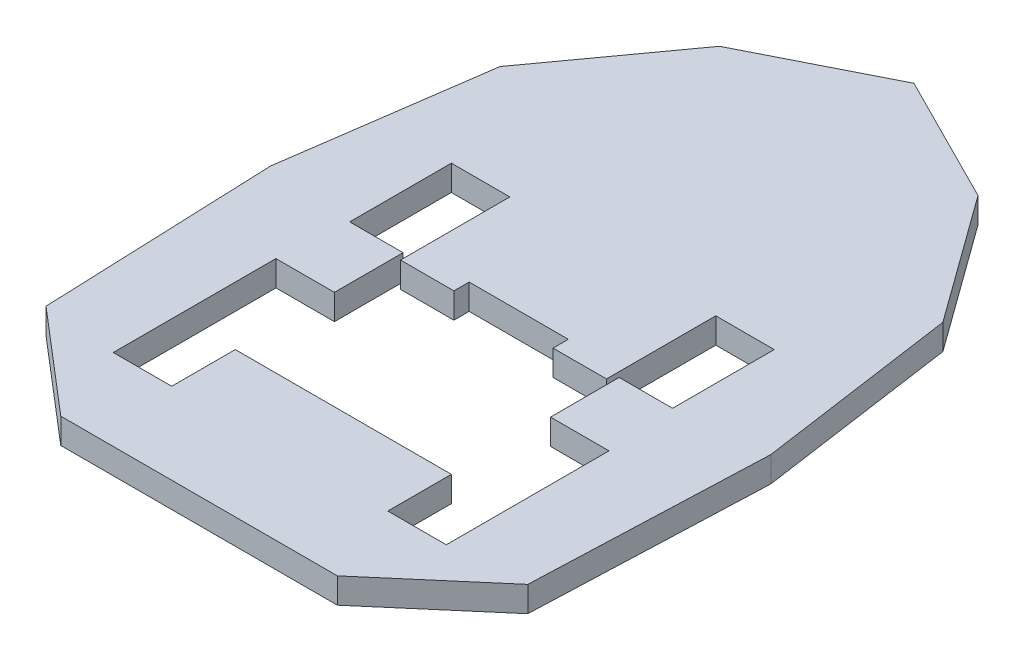
ISO-10303-21;
HEADER;
FILE_DESCRIPTION(('STEP AP214'),'2;1');
FILE_NAME('part.step','',(''),(''),'','','');
FILE_SCHEMA(('AUTOMOTIVE_DESIGN { 1 0 10303 214 1 1 1 1 }'));
ENDSEC;
DATA;
#1=APPLICATION_CONTEXT('core data for automotive mechanical design processes');
#2=APPLICATION_PROTOCOL_DEFINITION('international standard','automotive_design',2000,#1);
#3=PRODUCT_CONTEXT('',#1,'mechanical');
#4=PRODUCT('Part','Part','',(#3));
#5=PRODUCT_RELATED_PRODUCT_CATEGORY('part','',(#4));
#6=PRODUCT_DEFINITION_FORMATION('','',#4);
#7=PRODUCT_DEFINITION_CONTEXT('part definition',#1,'design');
#8=PRODUCT_DEFINITION('design','',#6,#7);
#9=PRODUCT_DEFINITION_SHAPE('','',#8);
#10=(LENGTH_UNIT() NAMED_UNIT(*) SI_UNIT(.MILLI.,.METRE.));
#11=(NAMED_UNIT(*) PLANE_ANGLE_UNIT() SI_UNIT($,.RADIAN.));
#12=(NAMED_UNIT(*) SI_UNIT($,.STERADIAN.) SOLID_ANGLE_UNIT());
#13=UNCERTAINTY_MEASURE_WITH_UNIT(LENGTH_MEASURE(1.E-05),#10,'distance_accuracy_value','');
#14=(GEOMETRIC_REPRESENTATION_CONTEXT(3) GLOBAL_UNCERTAINTY_ASSIGNED_CONTEXT((#13)) GLOBAL_UNIT_ASSIGNED_CONTEXT((#10,
#11,#12)) REPRESENTATION_CONTEXT('',''));
#15=CARTESIAN_POINT('',(0.,0.,0.));
#16=DIRECTION('',(0.,0.,1.));
#17=DIRECTION('',(1.,0.,0.));
#18=AXIS2_PLACEMENT_3D('',#15,#16,#17);
#19=CARTESIAN_POINT('',(-441.846790113478,-50.,-319.981845912736));
#20=DIRECTION('',(-0.809921374663058,0.,-0.586538461538459));
#21=DIRECTION('',(-0.586538461538459,0.,0.809921374663058));
#22=AXIS2_PLACEMENT_3D('',#19,#20,#21);
#23=PLANE('',#22);
#24=DIRECTION('',(-0.586538461538459,0.,0.809921374663058));
#25=VECTOR('',#24,1.);
#26=CARTESIAN_POINT('',(-441.846790113478,0.,-319.981845912736));
#27=LINE('',#26,#25);
#28=CARTESIAN_POINT('',(-252.944628181074,0.,-580.827312496149));
#29=VERTEX_POINT('',#28);
#30=CARTESIAN_POINT('',(-434.221233960033,0.,-330.511591747595));
#31=VERTEX_POINT('',#30);
#32=EDGE_CURVE('E512',#29,#31,#27,.T.);
#33=ORIENTED_EDGE('',*,*,#32,.F.);
#34=DIRECTION('',(0.,1.,0.));
#35=VECTOR('',#34,1.);
#36=CARTESIAN_POINT('',(-252.944628181074,-50.,-580.827312496149));
#37=LINE('',#36,#35);
#38=CARTESIAN_POINT('',(-252.944628181074,-50.,-580.827312496149));
#39=VERTEX_POINT('',#38);
#40=EDGE_CURVE('E11',#39,#29,#37,.T.);
#41=ORIENTED_EDGE('',*,*,#40,.F.);
#42=DIRECTION('',(-0.586538461538459,0.,0.809921374663058));
#43=VECTOR('',#42,1.);
#44=CARTESIAN_POINT('',(-441.846790113478,-50.,-319.981845912736));
#45=LINE('',#44,#43);
#46=CARTESIAN_POINT('',(-434.221233960033,-50.,-330.511591747595));
#47=VERTEX_POINT('',#46);
#48=EDGE_CURVE('E639',#39,#47,#45,.T.);
#49=ORIENTED_EDGE('',*,*,#48,.T.);
#50=DIRECTION('',(0.,1.,0.));
#51=VECTOR('',#50,1.);
#52=CARTESIAN_POINT('',(-434.221233960033,-50.,-330.511591747595));
#53=LINE('',#52,#51);
#54=EDGE_CURVE('E336',#47,#31,#53,.T.);
#55=ORIENTED_EDGE('',*,*,#54,.T.);
#56=EDGE_LOOP('',(#33,#41,#49,#55));
#57=FACE_BOUND('',#56,.T.);
#58=ADVANCED_FACE('F51',(#57),#23,.T.);
#59=CARTESIAN_POINT('',(-284.843162384152,-50.,-564.738304024302));
#60=DIRECTION('',(-0.450340007604234,0.,-0.892857142857142));
#61=DIRECTION('',(-0.892857142857142,0.,0.450340007604234));
#62=AXIS2_PLACEMENT_3D('',#59,#60,#61);
#63=PLANE('',#62);
#64=DIRECTION('',(-0.892857142857142,0.,0.450340007604234));
#65=VECTOR('',#64,1.);
#66=CARTESIAN_POINT('',(-284.843162384152,0.,-564.738304024302));
#67=LINE('',#66,#65);
#68=CARTESIAN_POINT('',(1.29112639441303,0.,-709.058947942798));
#69=VERTEX_POINT('',#68);
#70=EDGE_CURVE('E549',#69,#29,#67,.T.);
#71=ORIENTED_EDGE('',*,*,#70,.F.);
#72=DIRECTION('',(0.,1.,0.));
#73=VECTOR('',#72,1.);
#74=CARTESIAN_POINT('',(1.29112639441303,-50.,-709.058947942798));
#75=LINE('',#74,#73);
#76=CARTESIAN_POINT('',(1.29112639441303,-50.,-709.058947942798));
#77=VERTEX_POINT('',#76);
#78=EDGE_CURVE('E62',#77,#69,#75,.T.);
#79=ORIENTED_EDGE('',*,*,#78,.F.);
#80=DIRECTION('',(-0.892857142857142,0.,0.450340007604234));
#81=VECTOR('',#80,1.);
#82=CARTESIAN_POINT('',(-284.843162384152,-50.,-564.738304024302));
#83=LINE('',#82,#81);
#84=EDGE_CURVE('E304',#77,#39,#83,.T.);
#85=ORIENTED_EDGE('',*,*,#84,.T.);
#86=ORIENTED_EDGE('',*,*,#40,.T.);
#87=EDGE_LOOP('',(#71,#79,#85,#86));
#88=FACE_BOUND('',#87,.T.);
#89=ADVANCED_FACE('F701',(#88),#63,.T.);
#90=CARTESIAN_POINT('',(285.366859059435,-50.,-565.776600221229));
#91=DIRECTION('',(-0.450340007604231,0.,0.892857142857143));
#92=DIRECTION('',(0.892857142857143,0.,0.450340007604231));
#93=AXIS2_PLACEMENT_3D('',#90,#91,#92);
#94=PLANE('',#93);
#95=DIRECTION('',(0.892857142857143,0.,0.450340007604231));
#96=VECTOR('',#95,1.);
#97=CARTESIAN_POINT('',(285.366859059435,0.,-565.776600221229));
#98=LINE('',#97,#96);
#99=CARTESIAN_POINT('',(255.5268809699,0.,-580.82731249615));
#100=VERTEX_POINT('',#99);
#101=EDGE_CURVE('E308',#69,#100,#98,.T.);
#102=ORIENTED_EDGE('',*,*,#101,.T.);
#103=DIRECTION('',(0.,1.,0.));
#104=VECTOR('',#103,1.);
#105=CARTESIAN_POINT('',(255.5268809699,-50.,-580.82731249615));
#106=LINE('',#105,#104);
#107=CARTESIAN_POINT('',(255.5268809699,-50.,-580.82731249615));
#108=VERTEX_POINT('',#107);
#109=EDGE_CURVE('E293',#108,#100,#106,.T.);
#110=ORIENTED_EDGE('',*,*,#109,.F.);
#111=DIRECTION('',(0.892857142857143,0.,0.450340007604231));
#112=VECTOR('',#111,1.);
#113=CARTESIAN_POINT('',(285.366859059435,-50.,-565.776600221229));
#114=LINE('',#113,#112);
#115=EDGE_CURVE('E299',#77,#108,#114,.T.);
#116=ORIENTED_EDGE('',*,*,#115,.F.);
#117=ORIENTED_EDGE('',*,*,#78,.T.);
#118=EDGE_LOOP('',(#102,#110,#116,#117));
#119=FACE_BOUND('',#118,.T.);
#120=ADVANCED_FACE('F307',(#119),#94,.F.);
#121=CARTESIAN_POINT('',(443.540677274788,-50.,-321.208545195773));
#122=DIRECTION('',(-0.809921374663057,0.,0.586538461538461));
#123=DIRECTION('',(0.586538461538461,0.,0.809921374663057));
#124=AXIS2_PLACEMENT_3D('',#121,#122,#123);
#125=PLANE('',#124);
#126=DIRECTION('',(0.586538461538461,0.,0.809921374663057));
#127=VECTOR('',#126,1.);
#128=CARTESIAN_POINT('',(443.540677274788,0.,-321.208545195773));
#129=LINE('',#128,#127);
#130=CARTESIAN_POINT('',(436.80348674886,0.,-330.511591747596));
#131=VERTEX_POINT('',#130);
#132=EDGE_CURVE('E544',#100,#131,#129,.T.);
#133=ORIENTED_EDGE('',*,*,#132,.T.);
#134=DIRECTION('',(0.,1.,0.));
#135=VECTOR('',#134,1.);
#136=CARTESIAN_POINT('',(436.80348674886,-50.,-330.511591747596));
#137=LINE('',#136,#135);
#138=CARTESIAN_POINT('',(436.80348674886,-50.,-330.511591747596));
#139=VERTEX_POINT('',#138);
#140=EDGE_CURVE('E295',#139,#131,#137,.T.);
#141=ORIENTED_EDGE('',*,*,#140,.F.);
#142=DIRECTION('',(0.586538461538461,0.,0.809921374663057));
#143=VECTOR('',#142,1.);
#144=CARTESIAN_POINT('',(443.540677274788,-50.,-321.208545195773));
#145=LINE('',#144,#143);
#146=EDGE_CURVE('E288',#108,#139,#145,.T.);
#147=ORIENTED_EDGE('',*,*,#146,.F.);
#148=ORIENTED_EDGE('',*,*,#109,.T.);
#149=EDGE_LOOP('',(#133,#141,#147,#148));
#150=FACE_BOUND('',#149,.T.);
#151=ADVANCED_FACE('F291',(#150),#125,.F.);
#152=CARTESIAN_POINT('',(474.245998064971,-50.,-67.5188176070536));
#153=DIRECTION('',(-0.990016779137899,0.,0.140949554896142));
#154=DIRECTION('',(0.140949554896142,0.,0.990016779137899));
#155=AXIS2_PLACEMENT_3D('',#152,#153,#154);
#156=PLANE('',#155);
#157=DIRECTION('',(0.140949554896142,0.,0.990016779137899));
#158=VECTOR('',#157,1.);
#159=CARTESIAN_POINT('',(474.245998064971,0.,-67.5188176070536));
#160=LINE('',#159,#158);
#161=CARTESIAN_POINT('',(492.998077488034,0.,64.1940727687835));
#162=VERTEX_POINT('',#161);
#163=EDGE_CURVE('E540',#131,#162,#160,.T.);
#164=ORIENTED_EDGE('',*,*,#163,.T.);
#165=DIRECTION('',(0.,1.,0.));
#166=VECTOR('',#165,1.);
#167=CARTESIAN_POINT('',(492.998077488034,-50.,64.1940727687835));
#168=LINE('',#167,#166);
#169=CARTESIAN_POINT('',(492.998077488034,-50.,64.1940727687835));
#170=VERTEX_POINT('',#169);
#171=EDGE_CURVE('E314',#170,#162,#168,.T.);
#172=ORIENTED_EDGE('',*,*,#171,.F.);
#173=DIRECTION('',(0.140949554896142,0.,0.990016779137899));
#174=VECTOR('',#173,1.);
#175=CARTESIAN_POINT('',(474.245998064971,-50.,-67.5188176070536));
#176=LINE('',#175,#174);
#177=EDGE_CURVE('E300',#139,#170,#176,.T.);
#178=ORIENTED_EDGE('',*,*,#177,.F.);
#179=ORIENTED_EDGE('',*,*,#140,.T.);
#180=EDGE_LOOP('',(#164,#172,#178,#179));
#181=FACE_BOUND('',#180,.T.);
#182=ADVANCED_FACE('F669',(#181),#156,.F.);
#183=CARTESIAN_POINT('',(494.749138972739,-50.,19.2953340438966));
#184=DIRECTION('',(-0.999240357191274,0.,-0.0389706114945063));
#185=DIRECTION('',(-0.0389706114945063,0.,0.999240357191274));
#186=AXIS2_PLACEMENT_3D('',#183,#184,#185);
#187=PLANE('',#186);
#188=DIRECTION('',(-0.0389706114945063,0.,0.999240357191274));
#189=VECTOR('',#188,1.);
#190=CARTESIAN_POINT('',(494.749138972739,0.,19.2953340438966));
#191=LINE('',#190,#189);
#192=CARTESIAN_POINT('',(475.060122819992,0.,524.138824528762));
#193=VERTEX_POINT('',#192);
#194=EDGE_CURVE('E536',#162,#193,#191,.T.);
#195=ORIENTED_EDGE('',*,*,#194,.T.);
#196=DIRECTION('',(0.,1.,0.));
#197=VECTOR('',#196,1.);
#198=CARTESIAN_POINT('',(475.060122819992,-50.,524.138824528762));
#199=LINE('',#198,#197);
#200=CARTESIAN_POINT('',(475.060122819992,-50.,524.138824528762));
#201=VERTEX_POINT('',#200);
#202=EDGE_CURVE('E320',#201,#193,#199,.T.);
#203=ORIENTED_EDGE('',*,*,#202,.F.);
#204=DIRECTION('',(-0.0389706114945063,0.,0.999240357191274));
#205=VECTOR('',#204,1.);
#206=CARTESIAN_POINT('',(494.749138972739,-50.,19.2953340438966));
#207=LINE('',#206,#205);
#208=EDGE_CURVE('E661',#170,#201,#207,.T.);
#209=ORIENTED_EDGE('',*,*,#208,.F.);
#210=ORIENTED_EDGE('',*,*,#171,.T.);
#211=EDGE_LOOP('',(#195,#203,#209,#210));
#212=FACE_BOUND('',#211,.T.);
#213=ADVANCED_FACE('F671',(#212),#187,.F.);
#214=CARTESIAN_POINT('',(459.798323418568,-50.,537.20161071037));
#215=DIRECTION('',(-0.650252980218132,0.,-0.759717751350748));
#216=DIRECTION('',(-0.759717751350748,0.,0.650252980218132));
#217=AXIS2_PLACEMENT_3D('',#214,#215,#216);
#218=PLANE('',#217);
#219=DIRECTION('',(-0.759717751350749,0.,0.650252980218132));
#220=VECTOR('',#219,1.);
#221=CARTESIAN_POINT('',(459.798323418568,0.,537.20161071037));
#222=LINE('',#221,#220);
#223=CARTESIAN_POINT('',(273.243244409874,0.,696.87669515397));
#224=VERTEX_POINT('',#223);
#225=EDGE_CURVE('E532',#193,#224,#222,.T.);
#226=ORIENTED_EDGE('',*,*,#225,.T.);
#227=DIRECTION('',(0.,1.,0.));
#228=VECTOR('',#227,1.);
#229=CARTESIAN_POINT('',(273.243244409874,-50.,696.87669515397));
#230=LINE('',#229,#228);
#231=CARTESIAN_POINT('',(273.243244409874,-50.,696.87669515397));
#232=VERTEX_POINT('',#231);
#233=EDGE_CURVE('E324',#232,#224,#230,.T.);
#234=ORIENTED_EDGE('',*,*,#233,.F.);
#235=DIRECTION('',(-0.759717751350749,0.,0.650252980218132));
#236=VECTOR('',#235,1.);
#237=CARTESIAN_POINT('',(459.798323418568,-50.,537.20161071037));
#238=LINE('',#237,#236);
#239=EDGE_CURVE('E658',#201,#232,#238,.T.);
#240=ORIENTED_EDGE('',*,*,#239,.F.);
#241=ORIENTED_EDGE('',*,*,#202,.T.);
#242=EDGE_LOOP('',(#226,#234,#240,#241));
#243=FACE_BOUND('',#242,.T.);
#244=ADVANCED_FACE('F673',(#243),#218,.F.);
#245=CARTESIAN_POINT('',(0.,-50.,696.87669515397));
#246=DIRECTION('',(0.,0.,1.));
#247=DIRECTION('',(1.,0.,0.));
#248=AXIS2_PLACEMENT_3D('',#245,#246,#247);
#249=PLANE('',#248);
#250=DIRECTION('',(1.,0.,0.));
#251=VECTOR('',#250,1.);
#252=CARTESIAN_POINT('',(0.,0.,696.87669515397));
#253=LINE('',#252,#251);
#254=CARTESIAN_POINT('',(-270.660991621045,0.,696.87669515397));
#255=VERTEX_POINT('',#254);
#256=EDGE_CURVE('E528',#255,#224,#253,.T.);
#257=ORIENTED_EDGE('',*,*,#256,.F.);
#258=DIRECTION('',(0.,1.,0.));
#259=VECTOR('',#258,1.);
#260=CARTESIAN_POINT('',(-270.660991621045,-50.,696.87669515397));
#261=LINE('',#260,#259);
#262=CARTESIAN_POINT('',(-270.660991621045,-50.,696.87669515397));
#263=VERTEX_POINT('',#262);
#264=EDGE_CURVE('E327',#263,#255,#261,.T.);
#265=ORIENTED_EDGE('',*,*,#264,.F.);
#266=DIRECTION('',(1.,0.,0.));
#267=VECTOR('',#266,1.);
#268=CARTESIAN_POINT('',(0.,-50.,696.87669515397));
#269=LINE('',#268,#267);
#270=EDGE_CURVE('E654',#263,#232,#269,.T.);
#271=ORIENTED_EDGE('',*,*,#270,.T.);
#272=ORIENTED_EDGE('',*,*,#233,.T.);
#273=EDGE_LOOP('',(#257,#265,#271,#272));
#274=FACE_BOUND('',#273,.T.);
#275=ADVANCED_FACE('F691',(#274),#249,.T.);
#276=CARTESIAN_POINT('',(-458.706472213489,-50.,535.925955284613));
#277=DIRECTION('',(-0.65025298021813,0.,0.75971775135075));
#278=DIRECTION('',(0.75971775135075,0.,0.65025298021813));
#279=AXIS2_PLACEMENT_3D('',#276,#277,#278);
#280=PLANE('',#279);
#281=DIRECTION('',(0.75971775135075,0.,0.65025298021813));
#282=VECTOR('',#281,1.);
#283=CARTESIAN_POINT('',(-458.706472213489,0.,535.925955284613));
#284=LINE('',#283,#282);
#285=CARTESIAN_POINT('',(-472.477870031163,0.,524.138824528762));
#286=VERTEX_POINT('',#285);
#287=EDGE_CURVE('E524',#286,#255,#284,.T.);
#288=ORIENTED_EDGE('',*,*,#287,.F.);
#289=DIRECTION('',(0.,1.,0.));
#290=VECTOR('',#289,1.);
#291=CARTESIAN_POINT('',(-472.477870031163,-50.,524.138824528762));
#292=LINE('',#291,#290);
#293=CARTESIAN_POINT('',(-472.477870031163,-50.,524.138824528762));
#294=VERTEX_POINT('',#293);
#295=EDGE_CURVE('E330',#294,#286,#292,.T.);
#296=ORIENTED_EDGE('',*,*,#295,.F.);
#297=DIRECTION('',(0.75971775135075,0.,0.65025298021813));
#298=VECTOR('',#297,1.);
#299=CARTESIAN_POINT('',(-458.706472213489,-50.,535.925955284613));
#300=LINE('',#299,#298);
#301=EDGE_CURVE('E650',#294,#263,#300,.T.);
#302=ORIENTED_EDGE('',*,*,#301,.T.);
#303=ORIENTED_EDGE('',*,*,#264,.T.);
#304=EDGE_LOOP('',(#288,#296,#302,#303));
#305=FACE_BOUND('',#304,.T.);
#306=ADVANCED_FACE('F681',(#305),#280,.T.);
#307=CARTESIAN_POINT('',(-492.170807873327,-50.,19.1947785180361));
#308=DIRECTION('',(-0.999240357191274,0.,0.0389706114945084));
#309=DIRECTION('',(0.0389706114945084,0.,0.999240357191274));
#310=AXIS2_PLACEMENT_3D('',#307,#308,#309);
#311=PLANE('',#310);
#312=DIRECTION('',(0.0389706114945084,0.,0.999240357191274));
#313=VECTOR('',#312,1.);
#314=CARTESIAN_POINT('',(-492.170807873327,0.,19.1947785180361));
#315=LINE('',#314,#313);
#316=CARTESIAN_POINT('',(-490.415824699206,0.,64.1940727687848));
#317=VERTEX_POINT('',#316);
#318=EDGE_CURVE('E520',#317,#286,#315,.T.);
#319=ORIENTED_EDGE('',*,*,#318,.F.);
#320=DIRECTION('',(0.,1.,0.));
#321=VECTOR('',#320,1.);
#322=CARTESIAN_POINT('',(-490.415824699206,-50.,64.1940727687848));
#323=LINE('',#322,#321);
#324=CARTESIAN_POINT('',(-490.415824699206,-50.,64.1940727687848));
#325=VERTEX_POINT('',#324);
#326=EDGE_CURVE('E333',#325,#317,#323,.T.);
#327=ORIENTED_EDGE('',*,*,#326,.F.);
#328=DIRECTION('',(0.0389706114945084,0.,0.999240357191274));
#329=VECTOR('',#328,1.);
#330=CARTESIAN_POINT('',(-492.170807873327,-50.,19.1947785180361));
#331=LINE('',#330,#329);
#332=EDGE_CURVE('E646',#325,#294,#331,.T.);
#333=ORIENTED_EDGE('',*,*,#332,.T.);
#334=ORIENTED_EDGE('',*,*,#295,.T.);
#335=EDGE_LOOP('',(#319,#327,#333,#334));
#336=FACE_BOUND('',#335,.T.);
#337=ADVANCED_FACE('F685',(#336),#311,.T.);
#338=CARTESIAN_POINT('',(0.,-50.,66.8766951539698));
#339=DIRECTION('',(0.,0.,-1.));
#340=DIRECTION('',(-1.,0.,0.));
#341=AXIS2_PLACEMENT_3D('',#338,#339,#340);
#342=PLANE('',#341);
#343=DIRECTION('',(-1.,0.,0.));
#344=VECTOR('',#343,1.);
#345=CARTESIAN_POINT('',(0.,0.,66.8766951539698));
#346=LINE('',#345,#344);
#347=CARTESIAN_POINT('',(97.4999999999999,0.,66.8766951539698));
#348=VERTEX_POINT('',#347);
#349=CARTESIAN_POINT('',(-97.4999999999999,0.,66.8766951539698));
#350=VERTEX_POINT('',#349);
#351=EDGE_CURVE('E426',#348,#350,#346,.T.);
#352=ORIENTED_EDGE('',*,*,#351,.T.);
#353=DIRECTION('',(0.,1.,0.));
#354=VECTOR('',#353,1.);
#355=CARTESIAN_POINT('',(-97.4999999999999,-50.,66.8766951539698));
#356=LINE('',#355,#354);
#357=CARTESIAN_POINT('',(-97.4999999999999,-50.,66.8766951539698));
#358=VERTEX_POINT('',#357);
#359=EDGE_CURVE('E339',#358,#350,#356,.T.);
#360=ORIENTED_EDGE('',*,*,#359,.F.);
#361=DIRECTION('',(-1.,0.,0.));
#362=VECTOR('',#361,1.);
#363=CARTESIAN_POINT('',(0.,-50.,66.8766951539698));
#364=LINE('',#363,#362);
#365=CARTESIAN_POINT('',(97.4999999999999,-50.,66.8766951539698));
#366=VERTEX_POINT('',#365);
#367=EDGE_CURVE('E552',#366,#358,#364,.T.);
#368=ORIENTED_EDGE('',*,*,#367,.F.);
#369=DIRECTION('',(0.,1.,0.));
#370=VECTOR('',#369,1.);
#371=CARTESIAN_POINT('',(97.4999999999999,-50.,66.8766951539698));
#372=LINE('',#371,#370);
#373=EDGE_CURVE('E55',#366,#348,#372,.T.);
#374=ORIENTED_EDGE('',*,*,#373,.T.);
#375=EDGE_LOOP('',(#352,#360,#368,#374));
#376=FACE_BOUND('',#375,.T.);
#377=ADVANCED_FACE('F53',(#376),#342,.F.);
#378=CARTESIAN_POINT('',(-97.4999999999999,-50.,0.));
#379=DIRECTION('',(1.,0.,0.));
#380=DIRECTION('',(0.,0.,-1.));
#381=AXIS2_PLACEMENT_3D('',#378,#379,#380);
#382=PLANE('',#381);
#383=DIRECTION('',(0.,0.,-1.));
#384=VECTOR('',#383,1.);
#385=CARTESIAN_POINT('',(-97.4999999999999,0.,0.));
#386=LINE('',#385,#384);
#387=CARTESIAN_POINT('',(-97.4999999999999,0.,96.8766951539698));
#388=VERTEX_POINT('',#387);
#389=EDGE_CURVE('E508',#388,#350,#386,.T.);
#390=ORIENTED_EDGE('',*,*,#389,.F.);
#391=DIRECTION('',(0.,1.,0.));
#392=VECTOR('',#391,1.);
#393=CARTESIAN_POINT('',(-97.4999999999999,-50.,96.8766951539698));
#394=LINE('',#393,#392);
#395=CARTESIAN_POINT('',(-97.4999999999999,-50.,96.8766951539698));
#396=VERTEX_POINT('',#395);
#397=EDGE_CURVE('E342',#396,#388,#394,.T.);
#398=ORIENTED_EDGE('',*,*,#397,.F.);
#399=DIRECTION('',(0.,0.,-1.));
#400=VECTOR('',#399,1.);
#401=CARTESIAN_POINT('',(-97.4999999999999,-50.,0.));
#402=LINE('',#401,#400);
#403=EDGE_CURVE('E635',#396,#358,#402,.T.);
#404=ORIENTED_EDGE('',*,*,#403,.T.);
#405=ORIENTED_EDGE('',*,*,#359,.T.);
#406=EDGE_LOOP('',(#390,#398,#404,#405));
#407=FACE_BOUND('',#406,.T.);
#408=ADVANCED_FACE('F710',(#407),#382,.T.);
#409=CARTESIAN_POINT('',(0.,-50.,96.8766951539698));
#410=DIRECTION('',(0.,0.,1.));
#411=DIRECTION('',(1.,0.,0.));
#412=AXIS2_PLACEMENT_3D('',#409,#410,#411);
#413=PLANE('',#412);
#414=DIRECTION('',(1.,0.,0.));
#415=VECTOR('',#414,1.);
#416=CARTESIAN_POINT('',(0.,0.,96.8766951539698));
#417=LINE('',#416,#415);
#418=CARTESIAN_POINT('',(-202.5,0.,96.8766951539698));
#419=VERTEX_POINT('',#418);
#420=EDGE_CURVE('E504',#419,#388,#417,.T.);
#421=ORIENTED_EDGE('',*,*,#420,.F.);
#422=DIRECTION('',(0.,1.,0.));
#423=VECTOR('',#422,1.);
#424=CARTESIAN_POINT('',(-202.5,-50.,96.8766951539698));
#425=LINE('',#424,#423);
#426=CARTESIAN_POINT('',(-202.5,-50.,96.8766951539698));
#427=VERTEX_POINT('',#426);
#428=EDGE_CURVE('E345',#427,#419,#425,.T.);
#429=ORIENTED_EDGE('',*,*,#428,.F.);
#430=DIRECTION('',(1.,0.,0.));
#431=VECTOR('',#430,1.);
#432=CARTESIAN_POINT('',(0.,-50.,96.8766951539698));
#433=LINE('',#432,#431);
#434=EDGE_CURVE('E631',#427,#396,#433,.T.);
#435=ORIENTED_EDGE('',*,*,#434,.T.);
#436=ORIENTED_EDGE('',*,*,#397,.T.);
#437=EDGE_LOOP('',(#421,#429,#435,#436));
#438=FACE_BOUND('',#437,.T.);
#439=ADVANCED_FACE('F713',(#438),#413,.T.);
#440=CARTESIAN_POINT('',(-202.5,-50.,0.));
#441=DIRECTION('',(-1.,0.,0.));
#442=DIRECTION('',(0.,0.,1.));
#443=AXIS2_PLACEMENT_3D('',#440,#441,#442);
#444=PLANE('',#443);
#445=DIRECTION('',(0.,0.,1.));
#446=VECTOR('',#445,1.);
#447=CARTESIAN_POINT('',(-202.5,0.,0.));
#448=LINE('',#447,#446);
#449=CARTESIAN_POINT('',(-202.5,0.,-118.12330484603));
#450=VERTEX_POINT('',#449);
#451=EDGE_CURVE('E500',#450,#419,#448,.T.);
#452=ORIENTED_EDGE('',*,*,#451,.F.);
#453=DIRECTION('',(0.,1.,0.));
#454=VECTOR('',#453,1.);
#455=CARTESIAN_POINT('',(-202.5,-50.,-118.12330484603));
#456=LINE('',#455,#454);
#457=CARTESIAN_POINT('',(-202.5,-50.,-118.12330484603));
#458=VERTEX_POINT('',#457);
#459=EDGE_CURVE('E348',#458,#450,#456,.T.);
#460=ORIENTED_EDGE('',*,*,#459,.F.);
#461=DIRECTION('',(0.,0.,1.));
#462=VECTOR('',#461,1.);
#463=CARTESIAN_POINT('',(-202.5,-50.,0.));
#464=LINE('',#463,#462);
#465=EDGE_CURVE('E627',#458,#427,#464,.T.);
#466=ORIENTED_EDGE('',*,*,#465,.T.);
#467=ORIENTED_EDGE('',*,*,#428,.T.);
#468=EDGE_LOOP('',(#452,#460,#466,#467));
#469=FACE_BOUND('',#468,.T.);
#470=ADVANCED_FACE('F717',(#469),#444,.T.);
#471=CARTESIAN_POINT('',(0.,-50.,-118.12330484603));
#472=DIRECTION('',(0.,0.,-1.));
#473=DIRECTION('',(-1.,0.,0.));
#474=AXIS2_PLACEMENT_3D('',#471,#472,#473);
#475=PLANE('',#474);
#476=DIRECTION('',(-1.,0.,0.));
#477=VECTOR('',#476,1.);
#478=CARTESIAN_POINT('',(0.,0.,-118.12330484603));
#479=LINE('',#478,#477);
#480=CARTESIAN_POINT('',(-317.5,0.,-118.12330484603));
#481=VERTEX_POINT('',#480);
#482=EDGE_CURVE('E497',#450,#481,#479,.T.);
#483=ORIENTED_EDGE('',*,*,#482,.T.);
#484=DIRECTION('',(0.,1.,0.));
#485=VECTOR('',#484,1.);
#486=CARTESIAN_POINT('',(-317.5,-50.,-118.12330484603));
#487=LINE('',#486,#485);
#488=CARTESIAN_POINT('',(-317.5,-50.,-118.12330484603));
#489=VERTEX_POINT('',#488);
#490=EDGE_CURVE('E351',#489,#481,#487,.T.);
#491=ORIENTED_EDGE('',*,*,#490,.F.);
#492=DIRECTION('',(-1.,0.,0.));
#493=VECTOR('',#492,1.);
#494=CARTESIAN_POINT('',(0.,-50.,-118.12330484603));
#495=LINE('',#494,#493);
#496=EDGE_CURVE('E624',#458,#489,#495,.T.);
#497=ORIENTED_EDGE('',*,*,#496,.F.);
#498=ORIENTED_EDGE('',*,*,#459,.T.);
#499=EDGE_LOOP('',(#483,#491,#497,#498));
#500=FACE_BOUND('',#499,.T.);
#501=ADVANCED_FACE('F721',(#500),#475,.F.);
#502=CARTESIAN_POINT('',(-317.5,-50.,0.));
#503=DIRECTION('',(-1.,0.,0.));
#504=DIRECTION('',(0.,0.,1.));
#505=AXIS2_PLACEMENT_3D('',#502,#503,#504);
#506=PLANE('',#505);
#507=DIRECTION('',(0.,0.,1.));
#508=VECTOR('',#507,1.);
#509=CARTESIAN_POINT('',(-317.5,0.,0.));
#510=LINE('',#509,#508);
#511=CARTESIAN_POINT('',(-317.5,0.,81.8766951539698));
#512=VERTEX_POINT('',#511);
#513=EDGE_CURVE('E493',#481,#512,#510,.T.);
#514=ORIENTED_EDGE('',*,*,#513,.T.);
#515=DIRECTION('',(0.,1.,0.));
#516=VECTOR('',#515,1.);
#517=CARTESIAN_POINT('',(-317.5,-50.,81.8766951539698));
#518=LINE('',#517,#516);
#519=CARTESIAN_POINT('',(-317.5,-50.,81.8766951539698));
#520=VERTEX_POINT('',#519);
#521=EDGE_CURVE('E355',#520,#512,#518,.T.);
#522=ORIENTED_EDGE('',*,*,#521,.F.);
#523=DIRECTION('',(0.,0.,1.));
#524=VECTOR('',#523,1.);
#525=CARTESIAN_POINT('',(-317.5,-50.,0.));
#526=LINE('',#525,#524);
#527=EDGE_CURVE('E621',#489,#520,#526,.T.);
#528=ORIENTED_EDGE('',*,*,#527,.F.);
#529=ORIENTED_EDGE('',*,*,#490,.T.);
#530=EDGE_LOOP('',(#514,#522,#528,#529));
#531=FACE_BOUND('',#530,.T.);
#532=ADVANCED_FACE('F725',(#531),#506,.F.);
#533=CARTESIAN_POINT('',(0.,-50.,81.8766951539698));
#534=DIRECTION('',(0.,0.,-1.));
#535=DIRECTION('',(-1.,0.,0.));
#536=AXIS2_PLACEMENT_3D('',#533,#534,#535);
#537=PLANE('',#536);
#538=DIRECTION('',(-1.,0.,0.));
#539=VECTOR('',#538,1.);
#540=CARTESIAN_POINT('',(0.,0.,81.8766951539698));
#541=LINE('',#540,#539);
#542=CARTESIAN_POINT('',(-212.5,0.,81.8766951539698));
#543=VERTEX_POINT('',#542);
#544=EDGE_CURVE('E489',#543,#512,#541,.T.);
#545=ORIENTED_EDGE('',*,*,#544,.F.);
#546=DIRECTION('',(0.,1.,0.));
#547=VECTOR('',#546,1.);
#548=CARTESIAN_POINT('',(-212.5,-50.,81.8766951539698));
#549=LINE('',#548,#547);
#550=CARTESIAN_POINT('',(-212.5,-50.,81.8766951539698));
#551=VERTEX_POINT('',#550);
#552=EDGE_CURVE('E358',#551,#543,#549,.T.);
#553=ORIENTED_EDGE('',*,*,#552,.F.);
#554=DIRECTION('',(-1.,0.,0.));
#555=VECTOR('',#554,1.);
#556=CARTESIAN_POINT('',(0.,-50.,81.8766951539698));
#557=LINE('',#556,#555);
#558=EDGE_CURVE('E617',#551,#520,#557,.T.);
#559=ORIENTED_EDGE('',*,*,#558,.T.);
#560=ORIENTED_EDGE('',*,*,#521,.T.);
#561=EDGE_LOOP('',(#545,#553,#559,#560));
#562=FACE_BOUND('',#561,.T.);
#563=ADVANCED_FACE('F729',(#562),#537,.T.);
#564=CARTESIAN_POINT('',(-212.5,-50.,0.));
#565=DIRECTION('',(1.,0.,0.));
#566=DIRECTION('',(0.,0.,-1.));
#567=AXIS2_PLACEMENT_3D('',#564,#565,#566);
#568=PLANE('',#567);
#569=DIRECTION('',(0.,0.,-1.));
#570=VECTOR('',#569,1.);
#571=CARTESIAN_POINT('',(-212.5,0.,0.));
#572=LINE('',#571,#570);
#573=CARTESIAN_POINT('',(-212.5,0.,216.87669515397));
#574=VERTEX_POINT('',#573);
#575=EDGE_CURVE('E485',#574,#543,#572,.T.);
#576=ORIENTED_EDGE('',*,*,#575,.F.);
#577=DIRECTION('',(0.,1.,0.));
#578=VECTOR('',#577,1.);
#579=CARTESIAN_POINT('',(-212.5,-50.,216.87669515397));
#580=LINE('',#579,#578);
#581=CARTESIAN_POINT('',(-212.5,-50.,216.87669515397));
#582=VERTEX_POINT('',#581);
#583=EDGE_CURVE('E361',#582,#574,#580,.T.);
#584=ORIENTED_EDGE('',*,*,#583,.F.);
#585=DIRECTION('',(0.,0.,-1.));
#586=VECTOR('',#585,1.);
#587=CARTESIAN_POINT('',(-212.5,-50.,0.));
#588=LINE('',#587,#586);
#589=EDGE_CURVE('E613',#582,#551,#588,.T.);
#590=ORIENTED_EDGE('',*,*,#589,.T.);
#591=ORIENTED_EDGE('',*,*,#552,.T.);
#592=EDGE_LOOP('',(#576,#584,#590,#591));
#593=FACE_BOUND('',#592,.T.);
#594=ADVANCED_FACE('F733',(#593),#568,.T.);
#595=CARTESIAN_POINT('',(2.09375217795259E-13,-50.,216.87669515397));
#596=DIRECTION('',(0.,0.,1.));
#597=DIRECTION('',(1.,0.,0.));
#598=AXIS2_PLACEMENT_3D('',#595,#596,#597);
#599=PLANE('',#598);
#600=DIRECTION('',(1.,0.,0.));
#601=VECTOR('',#600,1.);
#602=CARTESIAN_POINT('',(2.09375217795259E-13,0.,216.87669515397));
#603=LINE('',#602,#601);
#604=CARTESIAN_POINT('',(-327.5,0.,216.87669515397));
#605=VERTEX_POINT('',#604);
#606=EDGE_CURVE('E481',#605,#574,#603,.T.);
#607=ORIENTED_EDGE('',*,*,#606,.F.);
#608=DIRECTION('',(0.,1.,0.));
#609=VECTOR('',#608,1.);
#610=CARTESIAN_POINT('',(-327.5,-50.,216.87669515397));
#611=LINE('',#610,#609);
#612=CARTESIAN_POINT('',(-327.5,-50.,216.87669515397));
#613=VERTEX_POINT('',#612);
#614=EDGE_CURVE('E364',#613,#605,#611,.T.);
#615=ORIENTED_EDGE('',*,*,#614,.F.);
#616=DIRECTION('',(1.,0.,0.));
#617=VECTOR('',#616,1.);
#618=CARTESIAN_POINT('',(2.09375217795259E-13,-50.,216.87669515397));
#619=LINE('',#618,#617);
#620=EDGE_CURVE('E609',#613,#582,#619,.T.);
#621=ORIENTED_EDGE('',*,*,#620,.T.);
#622=ORIENTED_EDGE('',*,*,#583,.T.);
#623=EDGE_LOOP('',(#607,#615,#621,#622));
#624=FACE_BOUND('',#623,.T.);
#625=ADVANCED_FACE('F737',(#624),#599,.T.);
#626=CARTESIAN_POINT('',(-327.5,-50.,1.70436581514721E-13));
#627=DIRECTION('',(1.,0.,0.));
#628=DIRECTION('',(0.,0.,-1.));
#629=AXIS2_PLACEMENT_3D('',#626,#627,#628);
#630=PLANE('',#629);
#631=DIRECTION('',(0.,0.,-1.));
#632=VECTOR('',#631,1.);
#633=CARTESIAN_POINT('',(-327.5,0.,1.70436581514721E-13));
#634=LINE('',#633,#632);
#635=CARTESIAN_POINT('',(-327.5,0.,536.87669515397));
#636=VERTEX_POINT('',#635);
#637=EDGE_CURVE('E477',#636,#605,#634,.T.);
#638=ORIENTED_EDGE('',*,*,#637,.F.);
#639=DIRECTION('',(0.,1.,0.));
#640=VECTOR('',#639,1.);
#641=CARTESIAN_POINT('',(-327.5,-50.,536.87669515397));
#642=LINE('',#641,#640);
#643=CARTESIAN_POINT('',(-327.5,-50.,536.87669515397));
#644=VERTEX_POINT('',#643);
#645=EDGE_CURVE('E367',#644,#636,#642,.T.);
#646=ORIENTED_EDGE('',*,*,#645,.F.);
#647=DIRECTION('',(0.,0.,-1.));
#648=VECTOR('',#647,1.);
#649=CARTESIAN_POINT('',(-327.5,-50.,1.70436581514721E-13));
#650=LINE('',#649,#648);
#651=EDGE_CURVE('E605',#644,#613,#650,.T.);
#652=ORIENTED_EDGE('',*,*,#651,.T.);
#653=ORIENTED_EDGE('',*,*,#614,.T.);
#654=EDGE_LOOP('',(#638,#646,#652,#653));
#655=FACE_BOUND('',#654,.T.);
#656=ADVANCED_FACE('F741',(#655),#630,.T.);
#657=CARTESIAN_POINT('',(1.03661368407756E-12,-50.,536.876695153969));
#658=DIRECTION('',(0.,0.,-1.));
#659=DIRECTION('',(-1.,0.,0.));
#660=AXIS2_PLACEMENT_3D('',#657,#658,#659);
#661=PLANE('',#660);
#662=DIRECTION('',(-1.,0.,0.));
#663=VECTOR('',#662,1.);
#664=CARTESIAN_POINT('',(1.03661368407756E-12,0.,536.876695153969));
#665=LINE('',#664,#663);
#666=CARTESIAN_POINT('',(-212.5,0.,536.87669515397));
#667=VERTEX_POINT('',#666);
#668=EDGE_CURVE('E473',#667,#636,#665,.T.);
#669=ORIENTED_EDGE('',*,*,#668,.F.);
#670=DIRECTION('',(0.,1.,0.));
#671=VECTOR('',#670,1.);
#672=CARTESIAN_POINT('',(-212.5,-50.,536.87669515397));
#673=LINE('',#672,#671);
#674=CARTESIAN_POINT('',(-212.5,-50.,536.87669515397));
#675=VERTEX_POINT('',#674);
#676=EDGE_CURVE('E370',#675,#667,#673,.T.);
#677=ORIENTED_EDGE('',*,*,#676,.F.);
#678=DIRECTION('',(-1.,0.,0.));
#679=VECTOR('',#678,1.);
#680=CARTESIAN_POINT('',(1.03661368407756E-12,-50.,536.876695153969));
#681=LINE('',#680,#679);
#682=EDGE_CURVE('E601',#675,#644,#681,.T.);
#683=ORIENTED_EDGE('',*,*,#682,.T.);
#684=ORIENTED_EDGE('',*,*,#645,.T.);
#685=EDGE_LOOP('',(#669,#677,#683,#684));
#686=FACE_BOUND('',#685,.T.);
#687=ADVANCED_FACE('F745',(#686),#661,.T.);
#688=CARTESIAN_POINT('',(-212.5,-50.,0.));
#689=DIRECTION('',(-1.,0.,0.));
#690=DIRECTION('',(0.,0.,1.));
#691=AXIS2_PLACEMENT_3D('',#688,#689,#690);
#692=PLANE('',#691);
#693=DIRECTION('',(0.,0.,1.));
#694=VECTOR('',#693,1.);
#695=CARTESIAN_POINT('',(-212.5,0.,0.));
#696=LINE('',#695,#694);
#697=CARTESIAN_POINT('',(-212.5,0.,411.87669515397));
#698=VERTEX_POINT('',#697);
#699=EDGE_CURVE('E469',#698,#667,#696,.T.);
#700=ORIENTED_EDGE('',*,*,#699,.F.);
#701=DIRECTION('',(0.,1.,0.));
#702=VECTOR('',#701,1.);
#703=CARTESIAN_POINT('',(-212.5,-50.,411.87669515397));
#704=LINE('',#703,#702);
#705=CARTESIAN_POINT('',(-212.5,-50.,411.87669515397));
#706=VERTEX_POINT('',#705);
#707=EDGE_CURVE('E373',#706,#698,#704,.T.);
#708=ORIENTED_EDGE('',*,*,#707,.F.);
#709=DIRECTION('',(0.,0.,1.));
#710=VECTOR('',#709,1.);
#711=CARTESIAN_POINT('',(-212.5,-50.,0.));
#712=LINE('',#711,#710);
#713=EDGE_CURVE('E597',#706,#675,#712,.T.);
#714=ORIENTED_EDGE('',*,*,#713,.T.);
#715=ORIENTED_EDGE('',*,*,#676,.T.);
#716=EDGE_LOOP('',(#700,#708,#714,#715));
#717=FACE_BOUND('',#716,.T.);
#718=ADVANCED_FACE('F749',(#717),#692,.T.);
#719=CARTESIAN_POINT('',(0.,-50.,411.87669515397));
#720=DIRECTION('',(0.,0.,-1.));
#721=DIRECTION('',(-1.,0.,0.));
#722=AXIS2_PLACEMENT_3D('',#719,#720,#721);
#723=PLANE('',#722);
#724=DIRECTION('',(-1.,0.,0.));
#725=VECTOR('',#724,1.);
#726=CARTESIAN_POINT('',(0.,0.,411.87669515397));
#727=LINE('',#726,#725);
#728=CARTESIAN_POINT('',(212.5,0.,411.87669515397));
#729=VERTEX_POINT('',#728);
#730=EDGE_CURVE('E465',#729,#698,#727,.T.);
#731=ORIENTED_EDGE('',*,*,#730,.F.);
#732=DIRECTION('',(0.,1.,0.));
#733=VECTOR('',#732,1.);
#734=CARTESIAN_POINT('',(212.5,-50.,411.87669515397));
#735=LINE('',#734,#733);
#736=CARTESIAN_POINT('',(212.5,-50.,411.87669515397));
#737=VERTEX_POINT('',#736);
#738=EDGE_CURVE('E376',#737,#729,#735,.T.);
#739=ORIENTED_EDGE('',*,*,#738,.F.);
#740=DIRECTION('',(-1.,0.,0.));
#741=VECTOR('',#740,1.);
#742=CARTESIAN_POINT('',(0.,-50.,411.87669515397));
#743=LINE('',#742,#741);
#744=EDGE_CURVE('E593',#737,#706,#743,.T.);
#745=ORIENTED_EDGE('',*,*,#744,.T.);
#746=ORIENTED_EDGE('',*,*,#707,.T.);
#747=EDGE_LOOP('',(#731,#739,#745,#746));
#748=FACE_BOUND('',#747,.T.);
#749=ADVANCED_FACE('F753',(#748),#723,.T.);
#750=CARTESIAN_POINT('',(212.5,-50.,0.));
#751=DIRECTION('',(-1.,0.,0.));
#752=DIRECTION('',(0.,0.,1.));
#753=AXIS2_PLACEMENT_3D('',#750,#751,#752);
#754=PLANE('',#753);
#755=DIRECTION('',(0.,0.,1.));
#756=VECTOR('',#755,1.);
#757=CARTESIAN_POINT('',(212.5,0.,0.));
#758=LINE('',#757,#756);
#759=CARTESIAN_POINT('',(212.5,0.,536.87669515397));
#760=VERTEX_POINT('',#759);
#761=EDGE_CURVE('E462',#729,#760,#758,.T.);
#762=ORIENTED_EDGE('',*,*,#761,.T.);
#763=DIRECTION('',(0.,1.,0.));
#764=VECTOR('',#763,1.);
#765=CARTESIAN_POINT('',(212.5,-50.,536.87669515397));
#766=LINE('',#765,#764);
#767=CARTESIAN_POINT('',(212.5,-50.,536.87669515397));
#768=VERTEX_POINT('',#767);
#769=EDGE_CURVE('E379',#768,#760,#766,.T.);
#770=ORIENTED_EDGE('',*,*,#769,.F.);
#771=DIRECTION('',(0.,0.,1.));
#772=VECTOR('',#771,1.);
#773=CARTESIAN_POINT('',(212.5,-50.,0.));
#774=LINE('',#773,#772);
#775=EDGE_CURVE('E590',#737,#768,#774,.T.);
#776=ORIENTED_EDGE('',*,*,#775,.F.);
#777=ORIENTED_EDGE('',*,*,#738,.T.);
#778=EDGE_LOOP('',(#762,#770,#776,#777));
#779=FACE_BOUND('',#778,.T.);
#780=ADVANCED_FACE('F757',(#779),#754,.F.);
#781=CARTESIAN_POINT('',(-5.18306842038781E-13,-50.,536.87669515397));
#782=DIRECTION('',(0.,0.,1.));
#783=DIRECTION('',(1.,0.,0.));
#784=AXIS2_PLACEMENT_3D('',#781,#782,#783);
#785=PLANE('',#784);
#786=DIRECTION('',(1.,0.,0.));
#787=VECTOR('',#786,1.);
#788=CARTESIAN_POINT('',(-5.18306842038781E-13,0.,536.87669515397));
#789=LINE('',#788,#787);
#790=CARTESIAN_POINT('',(327.5,0.,536.87669515397));
#791=VERTEX_POINT('',#790);
#792=EDGE_CURVE('E459',#760,#791,#789,.T.);
#793=ORIENTED_EDGE('',*,*,#792,.T.);
#794=DIRECTION('',(0.,1.,0.));
#795=VECTOR('',#794,1.);
#796=CARTESIAN_POINT('',(327.5,-50.,536.87669515397));
#797=LINE('',#796,#795);
#798=CARTESIAN_POINT('',(327.5,-50.,536.87669515397));
#799=VERTEX_POINT('',#798);
#800=EDGE_CURVE('E383',#799,#791,#797,.T.);
#801=ORIENTED_EDGE('',*,*,#800,.F.);
#802=DIRECTION('',(1.,0.,0.));
#803=VECTOR('',#802,1.);
#804=CARTESIAN_POINT('',(-5.18306842038781E-13,-50.,536.87669515397));
#805=LINE('',#804,#803);
#806=EDGE_CURVE('E587',#768,#799,#805,.T.);
#807=ORIENTED_EDGE('',*,*,#806,.F.);
#808=ORIENTED_EDGE('',*,*,#769,.T.);
#809=EDGE_LOOP('',(#793,#801,#807,#808));
#810=FACE_BOUND('',#809,.T.);
#811=ADVANCED_FACE('F761',(#810),#785,.F.);
#812=CARTESIAN_POINT('',(327.5,-50.,0.));
#813=DIRECTION('',(1.,0.,0.));
#814=DIRECTION('',(0.,0.,-1.));
#815=AXIS2_PLACEMENT_3D('',#812,#813,#814);
#816=PLANE('',#815);
#817=DIRECTION('',(0.,0.,-1.));
#818=VECTOR('',#817,1.);
#819=CARTESIAN_POINT('',(327.5,0.,0.));
#820=LINE('',#819,#818);
#821=CARTESIAN_POINT('',(327.5,0.,216.87669515397));
#822=VERTEX_POINT('',#821);
#823=EDGE_CURVE('E456',#791,#822,#820,.T.);
#824=ORIENTED_EDGE('',*,*,#823,.T.);
#825=DIRECTION('',(0.,1.,0.));
#826=VECTOR('',#825,1.);
#827=CARTESIAN_POINT('',(327.5,-50.,216.87669515397));
#828=LINE('',#827,#826);
#829=CARTESIAN_POINT('',(327.5,-50.,216.87669515397));
#830=VERTEX_POINT('',#829);
#831=EDGE_CURVE('E387',#830,#822,#828,.T.);
#832=ORIENTED_EDGE('',*,*,#831,.F.);
#833=DIRECTION('',(0.,0.,-1.));
#834=VECTOR('',#833,1.);
#835=CARTESIAN_POINT('',(327.5,-50.,0.));
#836=LINE('',#835,#834);
#837=EDGE_CURVE('E584',#799,#830,#836,.T.);
#838=ORIENTED_EDGE('',*,*,#837,.F.);
#839=ORIENTED_EDGE('',*,*,#800,.T.);
#840=EDGE_LOOP('',(#824,#832,#838,#839));
#841=FACE_BOUND('',#840,.T.);
#842=ADVANCED_FACE('F765',(#841),#816,.F.);
#843=CARTESIAN_POINT('',(-1.57031413346444E-13,-50.,216.87669515397));
#844=DIRECTION('',(0.,0.,-1.));
#845=DIRECTION('',(-1.,0.,0.));
#846=AXIS2_PLACEMENT_3D('',#843,#844,#845);
#847=PLANE('',#846);
#848=DIRECTION('',(-1.,0.,0.));
#849=VECTOR('',#848,1.);
#850=CARTESIAN_POINT('',(-1.57031413346444E-13,0.,216.87669515397));
#851=LINE('',#850,#849);
#852=CARTESIAN_POINT('',(212.5,0.,216.87669515397));
#853=VERTEX_POINT('',#852);
#854=EDGE_CURVE('E453',#822,#853,#851,.T.);
#855=ORIENTED_EDGE('',*,*,#854,.T.);
#856=DIRECTION('',(0.,1.,0.));
#857=VECTOR('',#856,1.);
#858=CARTESIAN_POINT('',(212.5,-50.,216.87669515397));
#859=LINE('',#858,#857);
#860=CARTESIAN_POINT('',(212.5,-50.,216.87669515397));
#861=VERTEX_POINT('',#860);
#862=EDGE_CURVE('E391',#861,#853,#859,.T.);
#863=ORIENTED_EDGE('',*,*,#862,.F.);
#864=DIRECTION('',(-1.,0.,0.));
#865=VECTOR('',#864,1.);
#866=CARTESIAN_POINT('',(-1.57031413346444E-13,-50.,216.87669515397));
#867=LINE('',#866,#865);
#868=EDGE_CURVE('E581',#830,#861,#867,.T.);
#869=ORIENTED_EDGE('',*,*,#868,.F.);
#870=ORIENTED_EDGE('',*,*,#831,.T.);
#871=EDGE_LOOP('',(#855,#863,#869,#870));
#872=FACE_BOUND('',#871,.T.);
#873=ADVANCED_FACE('F769',(#872),#847,.F.);
#874=CARTESIAN_POINT('',(212.5,-50.,0.));
#875=DIRECTION('',(1.,0.,0.));
#876=DIRECTION('',(0.,0.,-1.));
#877=AXIS2_PLACEMENT_3D('',#874,#875,#876);
#878=PLANE('',#877);
#879=DIRECTION('',(0.,0.,-1.));
#880=VECTOR('',#879,1.);
#881=CARTESIAN_POINT('',(212.5,0.,0.));
#882=LINE('',#881,#880);
#883=CARTESIAN_POINT('',(212.5,0.,81.8766951539697));
#884=VERTEX_POINT('',#883);
#885=EDGE_CURVE('E450',#853,#884,#882,.T.);
#886=ORIENTED_EDGE('',*,*,#885,.T.);
#887=DIRECTION('',(0.,1.,0.));
#888=VECTOR('',#887,1.);
#889=CARTESIAN_POINT('',(212.5,-50.,81.8766951539697));
#890=LINE('',#889,#888);
#891=CARTESIAN_POINT('',(212.5,-50.,81.8766951539697));
#892=VERTEX_POINT('',#891);
#893=EDGE_CURVE('E395',#892,#884,#890,.T.);
#894=ORIENTED_EDGE('',*,*,#893,.F.);
#895=DIRECTION('',(0.,0.,-1.));
#896=VECTOR('',#895,1.);
#897=CARTESIAN_POINT('',(212.5,-50.,0.));
#898=LINE('',#897,#896);
#899=EDGE_CURVE('E578',#861,#892,#898,.T.);
#900=ORIENTED_EDGE('',*,*,#899,.F.);
#901=ORIENTED_EDGE('',*,*,#862,.T.);
#902=EDGE_LOOP('',(#886,#894,#900,#901));
#903=FACE_BOUND('',#902,.T.);
#904=ADVANCED_FACE('F773',(#903),#878,.F.);
#905=CARTESIAN_POINT('',(0.,-50.,81.8766951539697));
#906=DIRECTION('',(0.,0.,1.));
#907=DIRECTION('',(1.,0.,0.));
#908=AXIS2_PLACEMENT_3D('',#905,#906,#907);
#909=PLANE('',#908);
#910=DIRECTION('',(1.,0.,0.));
#911=VECTOR('',#910,1.);
#912=CARTESIAN_POINT('',(0.,0.,81.8766951539697));
#913=LINE('',#912,#911);
#914=CARTESIAN_POINT('',(317.5,0.,81.8766951539697));
#915=VERTEX_POINT('',#914);
#916=EDGE_CURVE('E446',#884,#915,#913,.T.);
#917=ORIENTED_EDGE('',*,*,#916,.T.);
#918=DIRECTION('',(0.,1.,0.));
#919=VECTOR('',#918,1.);
#920=CARTESIAN_POINT('',(317.5,-50.,81.8766951539697));
#921=LINE('',#920,#919);
#922=CARTESIAN_POINT('',(317.5,-50.,81.8766951539697));
#923=VERTEX_POINT('',#922);
#924=EDGE_CURVE('E399',#923,#915,#921,.T.);
#925=ORIENTED_EDGE('',*,*,#924,.F.);
#926=DIRECTION('',(1.,0.,0.));
#927=VECTOR('',#926,1.);
#928=CARTESIAN_POINT('',(0.,-50.,81.8766951539697));
#929=LINE('',#928,#927);
#930=EDGE_CURVE('E575',#892,#923,#929,.T.);
#931=ORIENTED_EDGE('',*,*,#930,.F.);
#932=ORIENTED_EDGE('',*,*,#893,.T.);
#933=EDGE_LOOP('',(#917,#925,#931,#932));
#934=FACE_BOUND('',#933,.T.);
#935=ADVANCED_FACE('F777',(#934),#909,.F.);
#936=CARTESIAN_POINT('',(317.5,-50.,0.));
#937=DIRECTION('',(-1.,0.,0.));
#938=DIRECTION('',(0.,0.,1.));
#939=AXIS2_PLACEMENT_3D('',#936,#937,#938);
#940=PLANE('',#939);
#941=DIRECTION('',(0.,0.,1.));
#942=VECTOR('',#941,1.);
#943=CARTESIAN_POINT('',(317.5,0.,0.));
#944=LINE('',#943,#942);
#945=CARTESIAN_POINT('',(317.5,0.,-118.12330484603));
#946=VERTEX_POINT('',#945);
#947=EDGE_CURVE('E442',#946,#915,#944,.T.);
#948=ORIENTED_EDGE('',*,*,#947,.F.);
#949=DIRECTION('',(0.,1.,0.));
#950=VECTOR('',#949,1.);
#951=CARTESIAN_POINT('',(317.5,-50.,-118.12330484603));
#952=LINE('',#951,#950);
#953=CARTESIAN_POINT('',(317.5,-50.,-118.12330484603));
#954=VERTEX_POINT('',#953);
#955=EDGE_CURVE('E402',#954,#946,#952,.T.);
#956=ORIENTED_EDGE('',*,*,#955,.F.);
#957=DIRECTION('',(0.,0.,1.));
#958=VECTOR('',#957,1.);
#959=CARTESIAN_POINT('',(317.5,-50.,0.));
#960=LINE('',#959,#958);
#961=EDGE_CURVE('E571',#954,#923,#960,.T.);
#962=ORIENTED_EDGE('',*,*,#961,.T.);
#963=ORIENTED_EDGE('',*,*,#924,.T.);
#964=EDGE_LOOP('',(#948,#956,#962,#963));
#965=FACE_BOUND('',#964,.T.);
#966=ADVANCED_FACE('F781',(#965),#940,.T.);
#967=CARTESIAN_POINT('',(0.,-50.,-118.12330484603));
#968=DIRECTION('',(0.,0.,1.));
#969=DIRECTION('',(1.,0.,0.));
#970=AXIS2_PLACEMENT_3D('',#967,#968,#969);
#971=PLANE('',#970);
#972=DIRECTION('',(1.,0.,0.));
#973=VECTOR('',#972,1.);
#974=CARTESIAN_POINT('',(0.,0.,-118.12330484603));
#975=LINE('',#974,#973);
#976=CARTESIAN_POINT('',(202.5,0.,-118.12330484603));
#977=VERTEX_POINT('',#976);
#978=EDGE_CURVE('E438',#977,#946,#975,.T.);
#979=ORIENTED_EDGE('',*,*,#978,.F.);
#980=DIRECTION('',(0.,1.,0.));
#981=VECTOR('',#980,1.);
#982=CARTESIAN_POINT('',(202.5,-50.,-118.12330484603));
#983=LINE('',#982,#981);
#984=CARTESIAN_POINT('',(202.5,-50.,-118.12330484603));
#985=VERTEX_POINT('',#984);
#986=EDGE_CURVE('E405',#985,#977,#983,.T.);
#987=ORIENTED_EDGE('',*,*,#986,.F.);
#988=DIRECTION('',(1.,0.,0.));
#989=VECTOR('',#988,1.);
#990=CARTESIAN_POINT('',(0.,-50.,-118.12330484603));
#991=LINE('',#990,#989);
#992=EDGE_CURVE('E567',#985,#954,#991,.T.);
#993=ORIENTED_EDGE('',*,*,#992,.T.);
#994=ORIENTED_EDGE('',*,*,#955,.T.);
#995=EDGE_LOOP('',(#979,#987,#993,#994));
#996=FACE_BOUND('',#995,.T.);
#997=ADVANCED_FACE('F785',(#996),#971,.T.);
#998=CARTESIAN_POINT('',(202.5,-50.,3.74700270810991E-13));
#999=DIRECTION('',(-1.,0.,0.));
#1000=DIRECTION('',(0.,0.,1.));
#1001=AXIS2_PLACEMENT_3D('',#998,#999,#1000);
#1002=PLANE('',#1001);
#1003=DIRECTION('',(0.,0.,1.));
#1004=VECTOR('',#1003,1.);
#1005=CARTESIAN_POINT('',(202.5,0.,3.74700270810991E-13));
#1006=LINE('',#1005,#1004);
#1007=CARTESIAN_POINT('',(202.5,0.,96.8766951539697));
#1008=VERTEX_POINT('',#1007);
#1009=EDGE_CURVE('E435',#977,#1008,#1006,.T.);
#1010=ORIENTED_EDGE('',*,*,#1009,.T.);
#1011=DIRECTION('',(0.,1.,0.));
#1012=VECTOR('',#1011,1.);
#1013=CARTESIAN_POINT('',(202.5,-50.,96.8766951539697));
#1014=LINE('',#1013,#1012);
#1015=CARTESIAN_POINT('',(202.5,-50.,96.8766951539697));
#1016=VERTEX_POINT('',#1015);
#1017=EDGE_CURVE('E408',#1016,#1008,#1014,.T.);
#1018=ORIENTED_EDGE('',*,*,#1017,.F.);
#1019=DIRECTION('',(0.,0.,1.));
#1020=VECTOR('',#1019,1.);
#1021=CARTESIAN_POINT('',(202.5,-50.,3.74700270810991E-13));
#1022=LINE('',#1021,#1020);
#1023=EDGE_CURVE('E564',#985,#1016,#1022,.T.);
#1024=ORIENTED_EDGE('',*,*,#1023,.F.);
#1025=ORIENTED_EDGE('',*,*,#986,.T.);
#1026=EDGE_LOOP('',(#1010,#1018,#1024,#1025));
#1027=FACE_BOUND('',#1026,.T.);
#1028=ADVANCED_FACE('F789',(#1027),#1002,.F.);
#1029=CARTESIAN_POINT('',(0.,-50.,96.8766951539698));
#1030=DIRECTION('',(0.,0.,-1.));
#1031=DIRECTION('',(-1.,0.,0.));
#1032=AXIS2_PLACEMENT_3D('',#1029,#1030,#1031);
#1033=PLANE('',#1032);
#1034=DIRECTION('',(-1.,0.,0.));
#1035=VECTOR('',#1034,1.);
#1036=CARTESIAN_POINT('',(0.,0.,96.8766951539698));
#1037=LINE('',#1036,#1035);
#1038=CARTESIAN_POINT('',(97.4999999999999,0.,96.8766951539698));
#1039=VERTEX_POINT('',#1038);
#1040=EDGE_CURVE('E432',#1008,#1039,#1037,.T.);
#1041=ORIENTED_EDGE('',*,*,#1040,.T.);
#1042=DIRECTION('',(0.,1.,0.));
#1043=VECTOR('',#1042,1.);
#1044=CARTESIAN_POINT('',(97.4999999999999,-50.,96.8766951539698));
#1045=LINE('',#1044,#1043);
#1046=CARTESIAN_POINT('',(97.4999999999999,-50.,96.8766951539698));
#1047=VERTEX_POINT('',#1046);
#1048=EDGE_CURVE('E411',#1047,#1039,#1045,.T.);
#1049=ORIENTED_EDGE('',*,*,#1048,.F.);
#1050=DIRECTION('',(-1.,0.,0.));
#1051=VECTOR('',#1050,1.);
#1052=CARTESIAN_POINT('',(0.,-50.,96.8766951539698));
#1053=LINE('',#1052,#1051);
#1054=EDGE_CURVE('E559',#1016,#1047,#1053,.T.);
#1055=ORIENTED_EDGE('',*,*,#1054,.F.);
#1056=ORIENTED_EDGE('',*,*,#1017,.T.);
#1057=EDGE_LOOP('',(#1041,#1049,#1055,#1056));
#1058=FACE_BOUND('',#1057,.T.);
#1059=ADVANCED_FACE('F793',(#1058),#1033,.F.);
#1060=CARTESIAN_POINT('',(97.4999999999999,-50.,0.));
#1061=DIRECTION('',(1.,0.,0.));
#1062=DIRECTION('',(0.,0.,-1.));
#1063=AXIS2_PLACEMENT_3D('',#1060,#1061,#1062);
#1064=PLANE('',#1063);
#1065=DIRECTION('',(0.,0.,-1.));
#1066=VECTOR('',#1065,1.);
#1067=CARTESIAN_POINT('',(97.4999999999999,0.,0.));
#1068=LINE('',#1067,#1066);
#1069=EDGE_CURVE('E429',#1039,#348,#1068,.T.);
#1070=ORIENTED_EDGE('',*,*,#1069,.T.);
#1071=ORIENTED_EDGE('',*,*,#373,.F.);
#1072=DIRECTION('',(0.,0.,-1.));
#1073=VECTOR('',#1072,1.);
#1074=CARTESIAN_POINT('',(97.4999999999999,-50.,0.));
#1075=LINE('',#1074,#1073);
#1076=EDGE_CURVE('E191',#1047,#366,#1075,.T.);
#1077=ORIENTED_EDGE('',*,*,#1076,.F.);
#1078=ORIENTED_EDGE('',*,*,#1048,.T.);
#1079=EDGE_LOOP('',(#1070,#1071,#1077,#1078));
#1080=FACE_BOUND('',#1079,.T.);
#1081=ADVANCED_FACE('F796',(#1080),#1064,.F.);
#1082=CARTESIAN_POINT('',(-471.715046316523,-50.,-67.1584837925909));
#1083=DIRECTION('',(-0.990016779137899,0.,-0.140949554896139));
#1084=DIRECTION('',(-0.140949554896139,0.,0.990016779137899));
#1085=AXIS2_PLACEMENT_3D('',#1082,#1083,#1084);
#1086=PLANE('',#1085);
#1087=DIRECTION('',(-0.140949554896139,0.,0.990016779137899));
#1088=VECTOR('',#1087,1.);
#1089=CARTESIAN_POINT('',(-471.715046316523,0.,-67.1584837925909));
#1090=LINE('',#1089,#1088);
#1091=EDGE_CURVE('E516',#31,#317,#1090,.T.);
#1092=ORIENTED_EDGE('',*,*,#1091,.F.);
#1093=ORIENTED_EDGE('',*,*,#54,.F.);
#1094=DIRECTION('',(-0.140949554896139,0.,0.990016779137899));
#1095=VECTOR('',#1094,1.);
#1096=CARTESIAN_POINT('',(-471.715046316523,-50.,-67.1584837925909));
#1097=LINE('',#1096,#1095);
#1098=EDGE_CURVE('E642',#47,#325,#1097,.T.);
#1099=ORIENTED_EDGE('',*,*,#1098,.T.);
#1100=ORIENTED_EDGE('',*,*,#326,.T.);
#1101=EDGE_LOOP('',(#1092,#1093,#1099,#1100));
#1102=FACE_BOUND('',#1101,.T.);
#1103=ADVANCED_FACE('F689',(#1102),#1086,.T.);
#1104=CARTESIAN_POINT('',(0.,-50.,0.));
#1105=DIRECTION('',(0.,1.,0.));
#1106=DIRECTION('',(0.,0.,1.));
#1107=AXIS2_PLACEMENT_3D('',#1104,#1105,#1106);
#1108=PLANE('',#1107);
#1109=ORIENTED_EDGE('',*,*,#367,.T.);
#1110=ORIENTED_EDGE('',*,*,#403,.F.);
#1111=ORIENTED_EDGE('',*,*,#434,.F.);
#1112=ORIENTED_EDGE('',*,*,#465,.F.);
#1113=ORIENTED_EDGE('',*,*,#496,.T.);
#1114=ORIENTED_EDGE('',*,*,#527,.T.);
#1115=ORIENTED_EDGE('',*,*,#558,.F.);
#1116=ORIENTED_EDGE('',*,*,#589,.F.);
#1117=ORIENTED_EDGE('',*,*,#620,.F.);
#1118=ORIENTED_EDGE('',*,*,#651,.F.);
#1119=ORIENTED_EDGE('',*,*,#682,.F.);
#1120=ORIENTED_EDGE('',*,*,#713,.F.);
#1121=ORIENTED_EDGE('',*,*,#744,.F.);
#1122=ORIENTED_EDGE('',*,*,#775,.T.);
#1123=ORIENTED_EDGE('',*,*,#806,.T.);
#1124=ORIENTED_EDGE('',*,*,#837,.T.);
#1125=ORIENTED_EDGE('',*,*,#868,.T.);
#1126=ORIENTED_EDGE('',*,*,#899,.T.);
#1127=ORIENTED_EDGE('',*,*,#930,.T.);
#1128=ORIENTED_EDGE('',*,*,#961,.F.);
#1129=ORIENTED_EDGE('',*,*,#992,.F.);
#1130=ORIENTED_EDGE('',*,*,#1023,.T.);
#1131=ORIENTED_EDGE('',*,*,#1054,.T.);
#1132=ORIENTED_EDGE('',*,*,#1076,.T.);
#1133=EDGE_LOOP('',(#1109,#1110,#1111,#1112,#1113,#1114,#1115,#1116,#1117,#1118,#1119,#1120,
#1121,#1122,#1123,#1124,#1125,#1126,#1127,#1128,#1129,#1130,#1131,#1132));
#1134=FACE_BOUND('',#1133,.T.);
#1135=ORIENTED_EDGE('',*,*,#48,.F.);
#1136=ORIENTED_EDGE('',*,*,#84,.F.);
#1137=ORIENTED_EDGE('',*,*,#115,.T.);
#1138=ORIENTED_EDGE('',*,*,#146,.T.);
#1139=ORIENTED_EDGE('',*,*,#177,.T.);
#1140=ORIENTED_EDGE('',*,*,#208,.T.);
#1141=ORIENTED_EDGE('',*,*,#239,.T.);
#1142=ORIENTED_EDGE('',*,*,#270,.F.);
#1143=ORIENTED_EDGE('',*,*,#301,.F.);
#1144=ORIENTED_EDGE('',*,*,#332,.F.);
#1145=ORIENTED_EDGE('',*,*,#1098,.F.);
#1146=EDGE_LOOP('',(#1135,#1136,#1137,#1138,#1139,#1140,#1141,#1142,#1143,#1144,#1145));
#1147=FACE_BOUND('',#1146,.T.);
#1148=ADVANCED_FACE('F303',(#1134,#1147),#1108,.F.);
#1149=CARTESIAN_POINT('',(0.,0.,0.));
#1150=DIRECTION('',(0.,1.,0.));
#1151=DIRECTION('',(0.,0.,1.));
#1152=AXIS2_PLACEMENT_3D('',#1149,#1150,#1151);
#1153=PLANE('',#1152);
#1154=ORIENTED_EDGE('',*,*,#351,.F.);
#1155=ORIENTED_EDGE('',*,*,#1069,.F.);
#1156=ORIENTED_EDGE('',*,*,#1040,.F.);
#1157=ORIENTED_EDGE('',*,*,#1009,.F.);
#1158=ORIENTED_EDGE('',*,*,#978,.T.);
#1159=ORIENTED_EDGE('',*,*,#947,.T.);
#1160=ORIENTED_EDGE('',*,*,#916,.F.);
#1161=ORIENTED_EDGE('',*,*,#885,.F.);
#1162=ORIENTED_EDGE('',*,*,#854,.F.);
#1163=ORIENTED_EDGE('',*,*,#823,.F.);
#1164=ORIENTED_EDGE('',*,*,#792,.F.);
#1165=ORIENTED_EDGE('',*,*,#761,.F.);
#1166=ORIENTED_EDGE('',*,*,#730,.T.);
#1167=ORIENTED_EDGE('',*,*,#699,.T.);
#1168=ORIENTED_EDGE('',*,*,#668,.T.);
#1169=ORIENTED_EDGE('',*,*,#637,.T.);
#1170=ORIENTED_EDGE('',*,*,#606,.T.);
#1171=ORIENTED_EDGE('',*,*,#575,.T.);
#1172=ORIENTED_EDGE('',*,*,#544,.T.);
#1173=ORIENTED_EDGE('',*,*,#513,.F.);
#1174=ORIENTED_EDGE('',*,*,#482,.F.);
#1175=ORIENTED_EDGE('',*,*,#451,.T.);
#1176=ORIENTED_EDGE('',*,*,#420,.T.);
#1177=ORIENTED_EDGE('',*,*,#389,.T.);
#1178=EDGE_LOOP('',(#1154,#1155,#1156,#1157,#1158,#1159,#1160,#1161,#1162,#1163,#1164,#1165,
#1166,#1167,#1168,#1169,#1170,#1171,#1172,#1173,#1174,#1175,#1176,#1177));
#1179=FACE_BOUND('',#1178,.T.);
#1180=ORIENTED_EDGE('',*,*,#32,.T.);
#1181=ORIENTED_EDGE('',*,*,#1091,.T.);
#1182=ORIENTED_EDGE('',*,*,#318,.T.);
#1183=ORIENTED_EDGE('',*,*,#287,.T.);
#1184=ORIENTED_EDGE('',*,*,#256,.T.);
#1185=ORIENTED_EDGE('',*,*,#225,.F.);
#1186=ORIENTED_EDGE('',*,*,#194,.F.);
#1187=ORIENTED_EDGE('',*,*,#163,.F.);
#1188=ORIENTED_EDGE('',*,*,#132,.F.);
#1189=ORIENTED_EDGE('',*,*,#101,.F.);
#1190=ORIENTED_EDGE('',*,*,#70,.T.);
#1191=EDGE_LOOP('',(#1180,#1181,#1182,#1183,#1184,#1185,#1186,#1187,#1188,#1189,#1190));
#1192=FACE_BOUND('',#1191,.T.);
#1193=ADVANCED_FACE('F690',(#1179,#1192),#1153,.T.);
#1194=CLOSED_SHELL('',(#58,#89,#120,#151,#182,#213,#244,#275,#306,#337,#377,#408,#439,#470,#501,
#532,#563,#594,#625,#656,#687,#718,#749,#780,#811,#842,#873,#904,#935,#966,#997,#1028,#1059,
#1081,#1103,#1148,#1193));
#1195=MANIFOLD_SOLID_BREP('B2',#1194);
#1196=ADVANCED_BREP_SHAPE_REPRESENTATION('',(#18,#1195),#14);
#1197=SHAPE_DEFINITION_REPRESENTATION(#9,#1196);
ENDSEC;
END-ISO-10303-21;
